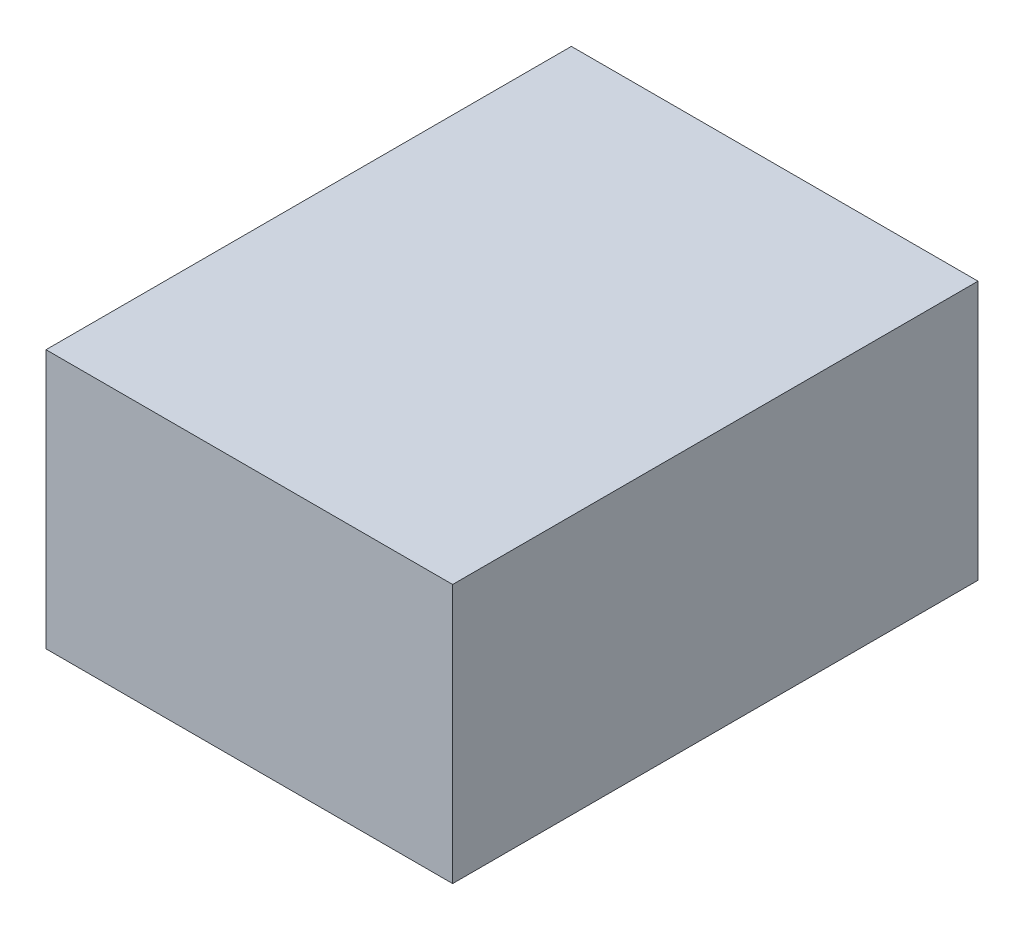
ISO-10303-21;
HEADER;
FILE_DESCRIPTION(('STEP AP214'),'2;1');
FILE_NAME('part.step','',(''),(''),'','','');
FILE_SCHEMA(('AUTOMOTIVE_DESIGN { 1 0 10303 214 1 1 1 1 }'));
ENDSEC;
DATA;
#1=APPLICATION_CONTEXT('core data for automotive mechanical design processes');
#2=APPLICATION_PROTOCOL_DEFINITION('international standard','automotive_design',2000,#1);
#3=PRODUCT_CONTEXT('',#1,'mechanical');
#4=PRODUCT('Part','Part','',(#3));
#5=PRODUCT_RELATED_PRODUCT_CATEGORY('part','',(#4));
#6=PRODUCT_DEFINITION_FORMATION('','',#4);
#7=PRODUCT_DEFINITION_CONTEXT('part definition',#1,'design');
#8=PRODUCT_DEFINITION('design','',#6,#7);
#9=PRODUCT_DEFINITION_SHAPE('','',#8);
#10=(LENGTH_UNIT() NAMED_UNIT(*) SI_UNIT(.MILLI.,.METRE.));
#11=(NAMED_UNIT(*) PLANE_ANGLE_UNIT() SI_UNIT($,.RADIAN.));
#12=(NAMED_UNIT(*) SI_UNIT($,.STERADIAN.) SOLID_ANGLE_UNIT());
#13=UNCERTAINTY_MEASURE_WITH_UNIT(LENGTH_MEASURE(1.E-05),#10,'distance_accuracy_value','');
#14=(GEOMETRIC_REPRESENTATION_CONTEXT(3) GLOBAL_UNCERTAINTY_ASSIGNED_CONTEXT((#13)) GLOBAL_UNIT_ASSIGNED_CONTEXT((#10,
#11,#12)) REPRESENTATION_CONTEXT('',''));
#15=CARTESIAN_POINT('',(0.,0.,0.));
#16=DIRECTION('',(0.,0.,1.));
#17=DIRECTION('',(1.,0.,0.));
#18=AXIS2_PLACEMENT_3D('',#15,#16,#17);
#19=CARTESIAN_POINT('',(0.,0.,0.));
#20=DIRECTION('',(0.,0.,1.));
#21=DIRECTION('',(1.,0.,0.));
#22=AXIS2_PLACEMENT_3D('',#19,#20,#21);
#23=PLANE('',#22);
#24=DIRECTION('',(-1.,0.,0.));
#25=VECTOR('',#24,1.);
#26=CARTESIAN_POINT('',(2500.,1675.,0.));
#27=LINE('',#26,#25);
#28=CARTESIAN_POINT('',(2500.,1675.,0.));
#29=VERTEX_POINT('',#28);
#30=CARTESIAN_POINT('',(-2500.,1675.,0.));
#31=VERTEX_POINT('',#30);
#32=EDGE_CURVE('E270',#29,#31,#27,.T.);
#33=ORIENTED_EDGE('',*,*,#32,.F.);
#34=DIRECTION('',(0.,-1.,0.));
#35=VECTOR('',#34,1.);
#36=CARTESIAN_POINT('',(2500.,1875.,0.));
#37=LINE('',#36,#35);
#38=CARTESIAN_POINT('',(2500.,1875.,0.));
#39=VERTEX_POINT('',#38);
#40=EDGE_CURVE('E265',#39,#29,#37,.T.);
#41=ORIENTED_EDGE('',*,*,#40,.F.);
#42=DIRECTION('',(1.,0.,0.));
#43=VECTOR('',#42,1.);
#44=CARTESIAN_POINT('',(2500.,1875.,0.));
#45=LINE('',#44,#43);
#46=CARTESIAN_POINT('',(-2500.,1875.,0.));
#47=VERTEX_POINT('',#46);
#48=EDGE_CURVE('E268',#47,#39,#45,.T.);
#49=ORIENTED_EDGE('',*,*,#48,.F.);
#50=DIRECTION('',(0.,1.,0.));
#51=VECTOR('',#50,1.);
#52=CARTESIAN_POINT('',(-2500.,1875.,0.));
#53=LINE('',#52,#51);
#54=EDGE_CURVE('E272',#31,#47,#53,.T.);
#55=ORIENTED_EDGE('',*,*,#54,.F.);
#56=EDGE_LOOP('',(#33,#41,#49,#55));
#57=FACE_BOUND('',#56,.T.);
#58=DIRECTION('',(0.,1.,0.));
#59=VECTOR('',#58,1.);
#60=CARTESIAN_POINT('',(3000.,-1875.,0.));
#61=LINE('',#60,#59);
#62=CARTESIAN_POINT('',(3000.,-1875.,0.));
#63=VERTEX_POINT('',#62);
#64=CARTESIAN_POINT('',(3000.,1875.,0.));
#65=VERTEX_POINT('',#64);
#66=EDGE_CURVE('E302',#63,#65,#61,.T.);
#67=ORIENTED_EDGE('',*,*,#66,.T.);
#68=DIRECTION('',(-1.,0.,0.));
#69=VECTOR('',#68,1.);
#70=CARTESIAN_POINT('',(3000.,1875.,0.));
#71=LINE('',#70,#69);
#72=CARTESIAN_POINT('',(2550.,1875.,0.));
#73=VERTEX_POINT('',#72);
#74=EDGE_CURVE('E337',#65,#73,#71,.T.);
#75=ORIENTED_EDGE('',*,*,#74,.T.);
#76=DIRECTION('',(0.,1.,0.));
#77=VECTOR('',#76,1.);
#78=CARTESIAN_POINT('',(2550.,-1875.,0.));
#79=LINE('',#78,#77);
#80=CARTESIAN_POINT('',(2550.,-1875.,0.));
#81=VERTEX_POINT('',#80);
#82=EDGE_CURVE('E333',#81,#73,#79,.T.);
#83=ORIENTED_EDGE('',*,*,#82,.F.);
#84=DIRECTION('',(-1.,0.,0.));
#85=VECTOR('',#84,1.);
#86=CARTESIAN_POINT('',(3000.,-1875.,0.));
#87=LINE('',#86,#85);
#88=EDGE_CURVE('E330',#63,#81,#87,.T.);
#89=ORIENTED_EDGE('',*,*,#88,.F.);
#90=EDGE_LOOP('',(#67,#75,#83,#89));
#91=FACE_BOUND('',#90,.T.);
#92=DIRECTION('',(0.,-1.,0.));
#93=VECTOR('',#92,1.);
#94=CARTESIAN_POINT('',(-3100.,-1975.,0.));
#95=LINE('',#94,#93);
#96=CARTESIAN_POINT('',(-3100.,1975.,0.));
#97=VERTEX_POINT('',#96);
#98=CARTESIAN_POINT('',(-3100.,-1975.,0.));
#99=VERTEX_POINT('',#98);
#100=EDGE_CURVE('E208',#97,#99,#95,.T.);
#101=ORIENTED_EDGE('',*,*,#100,.F.);
#102=DIRECTION('',(-1.,0.,0.));
#103=VECTOR('',#102,1.);
#104=CARTESIAN_POINT('',(3100.,1975.,0.));
#105=LINE('',#104,#103);
#106=CARTESIAN_POINT('',(3100.,1975.,0.));
#107=VERTEX_POINT('',#106);
#108=EDGE_CURVE('E386',#107,#97,#105,.T.);
#109=ORIENTED_EDGE('',*,*,#108,.F.);
#110=DIRECTION('',(0.,1.,0.));
#111=VECTOR('',#110,1.);
#112=CARTESIAN_POINT('',(3100.,-1975.,0.));
#113=LINE('',#112,#111);
#114=CARTESIAN_POINT('',(3100.,-1975.,0.));
#115=VERTEX_POINT('',#114);
#116=EDGE_CURVE('E384',#115,#107,#113,.T.);
#117=ORIENTED_EDGE('',*,*,#116,.F.);
#118=DIRECTION('',(1.,0.,0.));
#119=VECTOR('',#118,1.);
#120=CARTESIAN_POINT('',(3100.,-1975.,0.));
#121=LINE('',#120,#119);
#122=EDGE_CURVE('E382',#99,#115,#121,.T.);
#123=ORIENTED_EDGE('',*,*,#122,.F.);
#124=EDGE_LOOP('',(#101,#109,#117,#123));
#125=FACE_BOUND('',#124,.T.);
#126=DIRECTION('',(0.,-1.,0.));
#127=VECTOR('',#126,1.);
#128=CARTESIAN_POINT('',(-2500.,-1875.,0.));
#129=LINE('',#128,#127);
#130=CARTESIAN_POINT('',(-2500.,1625.,0.));
#131=VERTEX_POINT('',#130);
#132=CARTESIAN_POINT('',(-2500.,-1875.,0.));
#133=VERTEX_POINT('',#132);
#134=EDGE_CURVE('E319',#131,#133,#129,.T.);
#135=ORIENTED_EDGE('',*,*,#134,.T.);
#136=DIRECTION('',(1.,0.,0.));
#137=VECTOR('',#136,1.);
#138=CARTESIAN_POINT('',(-2500.,-1875.,0.));
#139=LINE('',#138,#137);
#140=CARTESIAN_POINT('',(2500.,-1875.,0.));
#141=VERTEX_POINT('',#140);
#142=EDGE_CURVE('E364',#133,#141,#139,.T.);
#143=ORIENTED_EDGE('',*,*,#142,.T.);
#144=DIRECTION('',(0.,1.,0.));
#145=VECTOR('',#144,1.);
#146=CARTESIAN_POINT('',(2500.,-1875.,0.));
#147=LINE('',#146,#145);
#148=CARTESIAN_POINT('',(2500.,1625.,0.));
#149=VERTEX_POINT('',#148);
#150=EDGE_CURVE('E367',#141,#149,#147,.T.);
#151=ORIENTED_EDGE('',*,*,#150,.T.);
#152=DIRECTION('',(-1.,0.,0.));
#153=VECTOR('',#152,1.);
#154=CARTESIAN_POINT('',(-2500.,1625.,0.));
#155=LINE('',#154,#153);
#156=EDGE_CURVE('E355',#149,#131,#155,.T.);
#157=ORIENTED_EDGE('',*,*,#156,.T.);
#158=EDGE_LOOP('',(#135,#143,#151,#157));
#159=FACE_BOUND('',#158,.T.);
#160=DIRECTION('',(0.,1.,0.));
#161=VECTOR('',#160,1.);
#162=CARTESIAN_POINT('',(-2550.,-1882.08551102095,0.));
#163=LINE('',#162,#161);
#164=CARTESIAN_POINT('',(-2550.,-1882.08551102095,0.));
#165=VERTEX_POINT('',#164);
#166=CARTESIAN_POINT('',(-2550.,1867.91448897905,0.));
#167=VERTEX_POINT('',#166);
#168=EDGE_CURVE('E298',#165,#167,#163,.T.);
#169=ORIENTED_EDGE('',*,*,#168,.T.);
#170=DIRECTION('',(-1.,0.,0.));
#171=VECTOR('',#170,1.);
#172=CARTESIAN_POINT('',(-2550.,1867.91448897905,0.));
#173=LINE('',#172,#171);
#174=CARTESIAN_POINT('',(-3000.,1867.91448897905,0.));
#175=VERTEX_POINT('',#174);
#176=EDGE_CURVE('E301',#167,#175,#173,.T.);
#177=ORIENTED_EDGE('',*,*,#176,.T.);
#178=DIRECTION('',(0.,1.,0.));
#179=VECTOR('',#178,1.);
#180=CARTESIAN_POINT('',(-3000.,-1882.08551102095,0.));
#181=LINE('',#180,#179);
#182=CARTESIAN_POINT('',(-3000.,-1882.08551102095,0.));
#183=VERTEX_POINT('',#182);
#184=EDGE_CURVE('E305',#183,#175,#181,.T.);
#185=ORIENTED_EDGE('',*,*,#184,.F.);
#186=DIRECTION('',(-1.,0.,0.));
#187=VECTOR('',#186,1.);
#188=CARTESIAN_POINT('',(-2550.,-1882.08551102095,0.));
#189=LINE('',#188,#187);
#190=EDGE_CURVE('E289',#165,#183,#189,.T.);
#191=ORIENTED_EDGE('',*,*,#190,.F.);
#192=EDGE_LOOP('',(#169,#177,#185,#191));
#193=FACE_BOUND('',#192,.T.);
#194=ADVANCED_FACE('F41',(#57,#91,#125,#159,#193),#23,.F.);
#195=CARTESIAN_POINT('',(-3100.,-1975.,8000.));
#196=DIRECTION('',(1.,0.,0.));
#197=DIRECTION('',(0.,0.,-1.));
#198=AXIS2_PLACEMENT_3D('',#195,#196,#197);
#199=PLANE('',#198);
#200=ORIENTED_EDGE('',*,*,#100,.T.);
#201=DIRECTION('',(0.,0.,-1.));
#202=VECTOR('',#201,1.);
#203=CARTESIAN_POINT('',(-3100.,-1975.,8000.));
#204=LINE('',#203,#202);
#205=CARTESIAN_POINT('',(-3100.,-1975.,8010.));
#206=VERTEX_POINT('',#205);
#207=EDGE_CURVE('E49',#206,#99,#204,.T.);
#208=ORIENTED_EDGE('',*,*,#207,.F.);
#209=DIRECTION('',(0.,-1.,0.));
#210=VECTOR('',#209,1.);
#211=CARTESIAN_POINT('',(-3100.,-1975.,8010.));
#212=LINE('',#211,#210);
#213=CARTESIAN_POINT('',(-3100.,1975.,8010.));
#214=VERTEX_POINT('',#213);
#215=EDGE_CURVE('E206',#214,#206,#212,.T.);
#216=ORIENTED_EDGE('',*,*,#215,.F.);
#217=DIRECTION('',(0.,0.,-1.));
#218=VECTOR('',#217,1.);
#219=CARTESIAN_POINT('',(-3100.,1975.,8000.));
#220=LINE('',#219,#218);
#221=EDGE_CURVE('E388',#214,#97,#220,.T.);
#222=ORIENTED_EDGE('',*,*,#221,.T.);
#223=EDGE_LOOP('',(#200,#208,#216,#222));
#224=FACE_BOUND('',#223,.T.);
#225=ADVANCED_FACE('F43',(#224),#199,.F.);
#226=CARTESIAN_POINT('',(3100.,-1975.,8000.));
#227=DIRECTION('',(0.,1.,0.));
#228=DIRECTION('',(-1.,0.,0.));
#229=AXIS2_PLACEMENT_3D('',#226,#227,#228);
#230=PLANE('',#229);
#231=ORIENTED_EDGE('',*,*,#122,.T.);
#232=DIRECTION('',(0.,0.,-1.));
#233=VECTOR('',#232,1.);
#234=CARTESIAN_POINT('',(3100.,-1975.,8000.));
#235=LINE('',#234,#233);
#236=CARTESIAN_POINT('',(3100.,-1975.,8010.));
#237=VERTEX_POINT('',#236);
#238=EDGE_CURVE('E210',#237,#115,#235,.T.);
#239=ORIENTED_EDGE('',*,*,#238,.F.);
#240=DIRECTION('',(1.,0.,0.));
#241=VECTOR('',#240,1.);
#242=CARTESIAN_POINT('',(-3100.,-1975.,8010.));
#243=LINE('',#242,#241);
#244=EDGE_CURVE('E212',#206,#237,#243,.T.);
#245=ORIENTED_EDGE('',*,*,#244,.F.);
#246=ORIENTED_EDGE('',*,*,#207,.T.);
#247=EDGE_LOOP('',(#231,#239,#245,#246));
#248=FACE_BOUND('',#247,.T.);
#249=ADVANCED_FACE('F213',(#248),#230,.F.);
#250=CARTESIAN_POINT('',(3100.,-1975.,8000.));
#251=DIRECTION('',(-1.,0.,0.));
#252=DIRECTION('',(0.,0.,1.));
#253=AXIS2_PLACEMENT_3D('',#250,#251,#252);
#254=PLANE('',#253);
#255=ORIENTED_EDGE('',*,*,#116,.T.);
#256=DIRECTION('',(0.,0.,-1.));
#257=VECTOR('',#256,1.);
#258=CARTESIAN_POINT('',(3100.,1975.,8000.));
#259=LINE('',#258,#257);
#260=CARTESIAN_POINT('',(3100.,1975.,8010.));
#261=VERTEX_POINT('',#260);
#262=EDGE_CURVE('E390',#261,#107,#259,.T.);
#263=ORIENTED_EDGE('',*,*,#262,.F.);
#264=DIRECTION('',(0.,1.,0.));
#265=VECTOR('',#264,1.);
#266=CARTESIAN_POINT('',(3100.,-1975.,8010.));
#267=LINE('',#266,#265);
#268=EDGE_CURVE('E218',#237,#261,#267,.T.);
#269=ORIENTED_EDGE('',*,*,#268,.F.);
#270=ORIENTED_EDGE('',*,*,#238,.T.);
#271=EDGE_LOOP('',(#255,#263,#269,#270));
#272=FACE_BOUND('',#271,.T.);
#273=ADVANCED_FACE('F395',(#272),#254,.F.);
#274=CARTESIAN_POINT('',(3100.,1975.,8000.));
#275=DIRECTION('',(0.,-1.,0.));
#276=DIRECTION('',(1.,0.,0.));
#277=AXIS2_PLACEMENT_3D('',#274,#275,#276);
#278=PLANE('',#277);
#279=ORIENTED_EDGE('',*,*,#108,.T.);
#280=ORIENTED_EDGE('',*,*,#221,.F.);
#281=DIRECTION('',(-1.,0.,0.));
#282=VECTOR('',#281,1.);
#283=CARTESIAN_POINT('',(-3100.,1975.,8010.));
#284=LINE('',#283,#282);
#285=EDGE_CURVE('E223',#261,#214,#284,.T.);
#286=ORIENTED_EDGE('',*,*,#285,.F.);
#287=ORIENTED_EDGE('',*,*,#262,.T.);
#288=EDGE_LOOP('',(#279,#280,#286,#287));
#289=FACE_BOUND('',#288,.T.);
#290=ADVANCED_FACE('F400',(#289),#278,.F.);
#291=CARTESIAN_POINT('',(-2500.,-1875.,6200.));
#292=DIRECTION('',(1.,0.,0.));
#293=DIRECTION('',(0.,0.,-1.));
#294=AXIS2_PLACEMENT_3D('',#291,#292,#293);
#295=PLANE('',#294);
#296=ORIENTED_EDGE('',*,*,#134,.F.);
#297=DIRECTION('',(0.,0.,-1.));
#298=VECTOR('',#297,1.);
#299=CARTESIAN_POINT('',(-2500.,1625.,6200.));
#300=LINE('',#299,#298);
#301=CARTESIAN_POINT('',(-2500.,1625.,6200.));
#302=VERTEX_POINT('',#301);
#303=EDGE_CURVE('E361',#302,#131,#300,.T.);
#304=ORIENTED_EDGE('',*,*,#303,.F.);
#305=DIRECTION('',(0.,-1.,0.));
#306=VECTOR('',#305,1.);
#307=CARTESIAN_POINT('',(-2500.,-1875.,6200.));
#308=LINE('',#307,#306);
#309=CARTESIAN_POINT('',(-2500.,-1875.,6200.));
#310=VERTEX_POINT('',#309);
#311=EDGE_CURVE('E351',#302,#310,#308,.T.);
#312=ORIENTED_EDGE('',*,*,#311,.T.);
#313=DIRECTION('',(0.,0.,-1.));
#314=VECTOR('',#313,1.);
#315=CARTESIAN_POINT('',(-2500.,-1875.,6200.));
#316=LINE('',#315,#314);
#317=EDGE_CURVE('E378',#310,#133,#316,.T.);
#318=ORIENTED_EDGE('',*,*,#317,.T.);
#319=EDGE_LOOP('',(#296,#304,#312,#318));
#320=FACE_BOUND('',#319,.T.);
#321=ADVANCED_FACE('F402',(#320),#295,.T.);
#322=CARTESIAN_POINT('',(-2500.,-1875.,6200.));
#323=DIRECTION('',(0.,1.,0.));
#324=DIRECTION('',(0.,0.,1.));
#325=AXIS2_PLACEMENT_3D('',#322,#323,#324);
#326=PLANE('',#325);
#327=ORIENTED_EDGE('',*,*,#142,.F.);
#328=ORIENTED_EDGE('',*,*,#317,.F.);
#329=DIRECTION('',(1.,0.,0.));
#330=VECTOR('',#329,1.);
#331=CARTESIAN_POINT('',(-2500.,-1875.,6200.));
#332=LINE('',#331,#330);
#333=CARTESIAN_POINT('',(2500.,-1875.,6200.));
#334=VERTEX_POINT('',#333);
#335=EDGE_CURVE('E354',#310,#334,#332,.T.);
#336=ORIENTED_EDGE('',*,*,#335,.T.);
#337=DIRECTION('',(0.,0.,-1.));
#338=VECTOR('',#337,1.);
#339=CARTESIAN_POINT('',(2500.,-1875.,6200.));
#340=LINE('',#339,#338);
#341=EDGE_CURVE('E376',#334,#141,#340,.T.);
#342=ORIENTED_EDGE('',*,*,#341,.T.);
#343=EDGE_LOOP('',(#327,#328,#336,#342));
#344=FACE_BOUND('',#343,.T.);
#345=ADVANCED_FACE('F409',(#344),#326,.T.);
#346=CARTESIAN_POINT('',(2500.,-1875.,6200.));
#347=DIRECTION('',(-1.,0.,0.));
#348=DIRECTION('',(0.,0.,1.));
#349=AXIS2_PLACEMENT_3D('',#346,#347,#348);
#350=PLANE('',#349);
#351=ORIENTED_EDGE('',*,*,#150,.F.);
#352=ORIENTED_EDGE('',*,*,#341,.F.);
#353=DIRECTION('',(0.,1.,0.));
#354=VECTOR('',#353,1.);
#355=CARTESIAN_POINT('',(2500.,-1875.,6200.));
#356=LINE('',#355,#354);
#357=CARTESIAN_POINT('',(2500.,1625.,6200.));
#358=VERTEX_POINT('',#357);
#359=EDGE_CURVE('E357',#334,#358,#356,.T.);
#360=ORIENTED_EDGE('',*,*,#359,.T.);
#361=DIRECTION('',(0.,0.,-1.));
#362=VECTOR('',#361,1.);
#363=CARTESIAN_POINT('',(2500.,1625.,6200.));
#364=LINE('',#363,#362);
#365=EDGE_CURVE('E374',#358,#149,#364,.T.);
#366=ORIENTED_EDGE('',*,*,#365,.T.);
#367=EDGE_LOOP('',(#351,#352,#360,#366));
#368=FACE_BOUND('',#367,.T.);
#369=ADVANCED_FACE('F424',(#368),#350,.T.);
#370=CARTESIAN_POINT('',(-2500.,1625.,6200.));
#371=DIRECTION('',(0.,-1.,0.));
#372=DIRECTION('',(0.,0.,-1.));
#373=AXIS2_PLACEMENT_3D('',#370,#371,#372);
#374=PLANE('',#373);
#375=ORIENTED_EDGE('',*,*,#156,.F.);
#376=ORIENTED_EDGE('',*,*,#365,.F.);
#377=DIRECTION('',(-1.,0.,0.));
#378=VECTOR('',#377,1.);
#379=CARTESIAN_POINT('',(-2500.,1625.,6200.));
#380=LINE('',#379,#378);
#381=EDGE_CURVE('E359',#358,#302,#380,.T.);
#382=ORIENTED_EDGE('',*,*,#381,.T.);
#383=ORIENTED_EDGE('',*,*,#303,.T.);
#384=EDGE_LOOP('',(#375,#376,#382,#383));
#385=FACE_BOUND('',#384,.T.);
#386=ADVANCED_FACE('F428',(#385),#374,.T.);
#387=CARTESIAN_POINT('',(0.,0.,6200.));
#388=DIRECTION('',(0.,0.,-1.));
#389=DIRECTION('',(-1.,0.,0.));
#390=AXIS2_PLACEMENT_3D('',#387,#388,#389);
#391=PLANE('',#390);
#392=ORIENTED_EDGE('',*,*,#311,.F.);
#393=ORIENTED_EDGE('',*,*,#381,.F.);
#394=ORIENTED_EDGE('',*,*,#359,.F.);
#395=ORIENTED_EDGE('',*,*,#335,.F.);
#396=EDGE_LOOP('',(#392,#393,#394,#395));
#397=FACE_BOUND('',#396,.T.);
#398=ADVANCED_FACE('F432',(#397),#391,.T.);
#399=CARTESIAN_POINT('',(3000.,-1875.,6200.));
#400=DIRECTION('',(-1.,0.,0.));
#401=DIRECTION('',(0.,0.,1.));
#402=AXIS2_PLACEMENT_3D('',#399,#400,#401);
#403=PLANE('',#402);
#404=ORIENTED_EDGE('',*,*,#66,.F.);
#405=DIRECTION('',(0.,0.,-1.));
#406=VECTOR('',#405,1.);
#407=CARTESIAN_POINT('',(3000.,-1875.,6200.));
#408=LINE('',#407,#406);
#409=CARTESIAN_POINT('',(3000.,-1875.,6200.));
#410=VERTEX_POINT('',#409);
#411=EDGE_CURVE('E326',#410,#63,#408,.T.);
#412=ORIENTED_EDGE('',*,*,#411,.F.);
#413=DIRECTION('',(0.,1.,0.));
#414=VECTOR('',#413,1.);
#415=CARTESIAN_POINT('',(3000.,-1875.,6200.));
#416=LINE('',#415,#414);
#417=CARTESIAN_POINT('',(3000.,1875.,6200.));
#418=VERTEX_POINT('',#417);
#419=EDGE_CURVE('E334',#410,#418,#416,.T.);
#420=ORIENTED_EDGE('',*,*,#419,.T.);
#421=DIRECTION('',(0.,0.,-1.));
#422=VECTOR('',#421,1.);
#423=CARTESIAN_POINT('',(3000.,1875.,6200.));
#424=LINE('',#423,#422);
#425=EDGE_CURVE('E279',#418,#65,#424,.T.);
#426=ORIENTED_EDGE('',*,*,#425,.T.);
#427=EDGE_LOOP('',(#404,#412,#420,#426));
#428=FACE_BOUND('',#427,.T.);
#429=ADVANCED_FACE('F436',(#428),#403,.T.);
#430=CARTESIAN_POINT('',(3000.,1875.,6200.));
#431=DIRECTION('',(0.,-1.,0.));
#432=DIRECTION('',(0.,0.,-1.));
#433=AXIS2_PLACEMENT_3D('',#430,#431,#432);
#434=PLANE('',#433);
#435=ORIENTED_EDGE('',*,*,#74,.F.);
#436=ORIENTED_EDGE('',*,*,#425,.F.);
#437=DIRECTION('',(-1.,0.,0.));
#438=VECTOR('',#437,1.);
#439=CARTESIAN_POINT('',(3000.,1875.,6200.));
#440=LINE('',#439,#438);
#441=CARTESIAN_POINT('',(2550.,1875.,6200.));
#442=VERTEX_POINT('',#441);
#443=EDGE_CURVE('E347',#418,#442,#440,.T.);
#444=ORIENTED_EDGE('',*,*,#443,.T.);
#445=DIRECTION('',(0.,0.,-1.));
#446=VECTOR('',#445,1.);
#447=CARTESIAN_POINT('',(2550.,1875.,6200.));
#448=LINE('',#447,#446);
#449=EDGE_CURVE('E322',#442,#73,#448,.T.);
#450=ORIENTED_EDGE('',*,*,#449,.T.);
#451=EDGE_LOOP('',(#435,#436,#444,#450));
#452=FACE_BOUND('',#451,.T.);
#453=ADVANCED_FACE('F450',(#452),#434,.T.);
#454=CARTESIAN_POINT('',(2550.,-1875.,6200.));
#455=DIRECTION('',(-1.,0.,0.));
#456=DIRECTION('',(0.,0.,1.));
#457=AXIS2_PLACEMENT_3D('',#454,#455,#456);
#458=PLANE('',#457);
#459=ORIENTED_EDGE('',*,*,#82,.T.);
#460=ORIENTED_EDGE('',*,*,#449,.F.);
#461=DIRECTION('',(0.,1.,0.));
#462=VECTOR('',#461,1.);
#463=CARTESIAN_POINT('',(2550.,-1875.,6200.));
#464=LINE('',#463,#462);
#465=CARTESIAN_POINT('',(2550.,-1875.,6200.));
#466=VERTEX_POINT('',#465);
#467=EDGE_CURVE('E344',#466,#442,#464,.T.);
#468=ORIENTED_EDGE('',*,*,#467,.F.);
#469=DIRECTION('',(0.,0.,-1.));
#470=VECTOR('',#469,1.);
#471=CARTESIAN_POINT('',(2550.,-1875.,6200.));
#472=LINE('',#471,#470);
#473=EDGE_CURVE('E324',#466,#81,#472,.T.);
#474=ORIENTED_EDGE('',*,*,#473,.T.);
#475=EDGE_LOOP('',(#459,#460,#468,#474));
#476=FACE_BOUND('',#475,.T.);
#477=ADVANCED_FACE('F446',(#476),#458,.F.);
#478=CARTESIAN_POINT('',(3000.,-1875.,6200.));
#479=DIRECTION('',(0.,-1.,0.));
#480=DIRECTION('',(1.,0.,0.));
#481=AXIS2_PLACEMENT_3D('',#478,#479,#480);
#482=PLANE('',#481);
#483=ORIENTED_EDGE('',*,*,#88,.T.);
#484=ORIENTED_EDGE('',*,*,#473,.F.);
#485=DIRECTION('',(-1.,0.,0.));
#486=VECTOR('',#485,1.);
#487=CARTESIAN_POINT('',(3000.,-1875.,6200.));
#488=LINE('',#487,#486);
#489=EDGE_CURVE('E329',#410,#466,#488,.T.);
#490=ORIENTED_EDGE('',*,*,#489,.F.);
#491=ORIENTED_EDGE('',*,*,#411,.T.);
#492=EDGE_LOOP('',(#483,#484,#490,#491));
#493=FACE_BOUND('',#492,.T.);
#494=ADVANCED_FACE('F442',(#493),#482,.F.);
#495=CARTESIAN_POINT('',(0.,0.,6200.));
#496=DIRECTION('',(0.,0.,1.));
#497=DIRECTION('',(1.,0.,0.));
#498=AXIS2_PLACEMENT_3D('',#495,#496,#497);
#499=PLANE('',#498);
#500=ORIENTED_EDGE('',*,*,#419,.F.);
#501=ORIENTED_EDGE('',*,*,#489,.T.);
#502=ORIENTED_EDGE('',*,*,#467,.T.);
#503=ORIENTED_EDGE('',*,*,#443,.F.);
#504=EDGE_LOOP('',(#500,#501,#502,#503));
#505=FACE_BOUND('',#504,.T.);
#506=ADVANCED_FACE('F438',(#505),#499,.F.);
#507=CARTESIAN_POINT('',(-2550.,-1882.08551102095,6200.));
#508=DIRECTION('',(-1.,0.,0.));
#509=DIRECTION('',(0.,0.,1.));
#510=AXIS2_PLACEMENT_3D('',#507,#508,#509);
#511=PLANE('',#510);
#512=ORIENTED_EDGE('',*,*,#168,.F.);
#513=DIRECTION('',(0.,0.,-1.));
#514=VECTOR('',#513,1.);
#515=CARTESIAN_POINT('',(-2550.,-1882.08551102095,6200.));
#516=LINE('',#515,#514);
#517=CARTESIAN_POINT('',(-2550.,-1882.08551102095,6200.));
#518=VERTEX_POINT('',#517);
#519=EDGE_CURVE('E297',#518,#165,#516,.T.);
#520=ORIENTED_EDGE('',*,*,#519,.F.);
#521=DIRECTION('',(0.,1.,0.));
#522=VECTOR('',#521,1.);
#523=CARTESIAN_POINT('',(-2550.,-1882.08551102095,6200.));
#524=LINE('',#523,#522);
#525=CARTESIAN_POINT('',(-2550.,1867.91448897905,6200.));
#526=VERTEX_POINT('',#525);
#527=EDGE_CURVE('E285',#518,#526,#524,.T.);
#528=ORIENTED_EDGE('',*,*,#527,.T.);
#529=DIRECTION('',(0.,0.,-1.));
#530=VECTOR('',#529,1.);
#531=CARTESIAN_POINT('',(-2550.,1867.91448897905,6200.));
#532=LINE('',#531,#530);
#533=EDGE_CURVE('E316',#526,#167,#532,.T.);
#534=ORIENTED_EDGE('',*,*,#533,.T.);
#535=EDGE_LOOP('',(#512,#520,#528,#534));
#536=FACE_BOUND('',#535,.T.);
#537=ADVANCED_FACE('F441',(#536),#511,.T.);
#538=CARTESIAN_POINT('',(-2550.,1867.91448897905,6200.));
#539=DIRECTION('',(0.,-1.,0.));
#540=DIRECTION('',(0.,0.,-1.));
#541=AXIS2_PLACEMENT_3D('',#538,#539,#540);
#542=PLANE('',#541);
#543=ORIENTED_EDGE('',*,*,#176,.F.);
#544=ORIENTED_EDGE('',*,*,#533,.F.);
#545=DIRECTION('',(-1.,0.,0.));
#546=VECTOR('',#545,1.);
#547=CARTESIAN_POINT('',(-2550.,1867.91448897905,6200.));
#548=LINE('',#547,#546);
#549=CARTESIAN_POINT('',(-3000.,1867.91448897905,6200.));
#550=VERTEX_POINT('',#549);
#551=EDGE_CURVE('E288',#526,#550,#548,.T.);
#552=ORIENTED_EDGE('',*,*,#551,.T.);
#553=DIRECTION('',(0.,0.,-1.));
#554=VECTOR('',#553,1.);
#555=CARTESIAN_POINT('',(-3000.,1867.91448897905,6200.));
#556=LINE('',#555,#554);
#557=EDGE_CURVE('E314',#550,#175,#556,.T.);
#558=ORIENTED_EDGE('',*,*,#557,.T.);
#559=EDGE_LOOP('',(#543,#544,#552,#558));
#560=FACE_BOUND('',#559,.T.);
#561=ADVANCED_FACE('F460',(#560),#542,.T.);
#562=CARTESIAN_POINT('',(-3000.,-1882.08551102095,6200.));
#563=DIRECTION('',(-1.,0.,0.));
#564=DIRECTION('',(0.,0.,1.));
#565=AXIS2_PLACEMENT_3D('',#562,#563,#564);
#566=PLANE('',#565);
#567=ORIENTED_EDGE('',*,*,#184,.T.);
#568=ORIENTED_EDGE('',*,*,#557,.F.);
#569=DIRECTION('',(0.,1.,0.));
#570=VECTOR('',#569,1.);
#571=CARTESIAN_POINT('',(-3000.,-1882.08551102095,6200.));
#572=LINE('',#571,#570);
#573=CARTESIAN_POINT('',(-3000.,-1882.08551102095,6200.));
#574=VERTEX_POINT('',#573);
#575=EDGE_CURVE('E291',#574,#550,#572,.T.);
#576=ORIENTED_EDGE('',*,*,#575,.F.);
#577=DIRECTION('',(0.,0.,-1.));
#578=VECTOR('',#577,1.);
#579=CARTESIAN_POINT('',(-3000.,-1882.08551102095,6200.));
#580=LINE('',#579,#578);
#581=EDGE_CURVE('E312',#574,#183,#580,.T.);
#582=ORIENTED_EDGE('',*,*,#581,.T.);
#583=EDGE_LOOP('',(#567,#568,#576,#582));
#584=FACE_BOUND('',#583,.T.);
#585=ADVANCED_FACE('F464',(#584),#566,.F.);
#586=CARTESIAN_POINT('',(-2550.,-1882.08551102095,6200.));
#587=DIRECTION('',(0.,-1.,0.));
#588=DIRECTION('',(0.,0.,-1.));
#589=AXIS2_PLACEMENT_3D('',#586,#587,#588);
#590=PLANE('',#589);
#591=ORIENTED_EDGE('',*,*,#190,.T.);
#592=ORIENTED_EDGE('',*,*,#581,.F.);
#593=DIRECTION('',(-1.,0.,0.));
#594=VECTOR('',#593,1.);
#595=CARTESIAN_POINT('',(-2550.,-1882.08551102095,6200.));
#596=LINE('',#595,#594);
#597=EDGE_CURVE('E294',#518,#574,#596,.T.);
#598=ORIENTED_EDGE('',*,*,#597,.F.);
#599=ORIENTED_EDGE('',*,*,#519,.T.);
#600=EDGE_LOOP('',(#591,#592,#598,#599));
#601=FACE_BOUND('',#600,.T.);
#602=ADVANCED_FACE('F468',(#601),#590,.F.);
#603=CARTESIAN_POINT('',(0.,0.,6200.));
#604=DIRECTION('',(0.,0.,1.));
#605=DIRECTION('',(1.,0.,0.));
#606=AXIS2_PLACEMENT_3D('',#603,#604,#605);
#607=PLANE('',#606);
#608=ORIENTED_EDGE('',*,*,#527,.F.);
#609=ORIENTED_EDGE('',*,*,#597,.T.);
#610=ORIENTED_EDGE('',*,*,#575,.T.);
#611=ORIENTED_EDGE('',*,*,#551,.F.);
#612=EDGE_LOOP('',(#608,#609,#610,#611));
#613=FACE_BOUND('',#612,.T.);
#614=ADVANCED_FACE('F472',(#613),#607,.F.);
#615=CARTESIAN_POINT('',(2500.,1875.,8000.));
#616=DIRECTION('',(1.,0.,0.));
#617=DIRECTION('',(0.,1.,0.));
#618=AXIS2_PLACEMENT_3D('',#615,#616,#617);
#619=PLANE('',#618);
#620=DIRECTION('',(0.,0.,-1.));
#621=VECTOR('',#620,1.);
#622=CARTESIAN_POINT('',(2500.,1675.,8000.));
#623=LINE('',#622,#621);
#624=CARTESIAN_POINT('',(2500.,1675.,6400.));
#625=VERTEX_POINT('',#624);
#626=EDGE_CURVE('E62',#625,#29,#623,.T.);
#627=ORIENTED_EDGE('',*,*,#626,.F.);
#628=DIRECTION('',(0.,1.,0.));
#629=VECTOR('',#628,1.);
#630=CARTESIAN_POINT('',(2500.,1875.,6400.));
#631=LINE('',#630,#629);
#632=CARTESIAN_POINT('',(2500.,1875.,6400.));
#633=VERTEX_POINT('',#632);
#634=EDGE_CURVE('E56',#625,#633,#631,.T.);
#635=ORIENTED_EDGE('',*,*,#634,.T.);
#636=DIRECTION('',(0.,0.,-1.));
#637=VECTOR('',#636,1.);
#638=CARTESIAN_POINT('',(2500.,1875.,8000.));
#639=LINE('',#638,#637);
#640=EDGE_CURVE('E277',#633,#39,#639,.T.);
#641=ORIENTED_EDGE('',*,*,#640,.T.);
#642=ORIENTED_EDGE('',*,*,#40,.T.);
#643=EDGE_LOOP('',(#627,#635,#641,#642));
#644=FACE_BOUND('',#643,.T.);
#645=ADVANCED_FACE('F476',(#644),#619,.F.);
#646=CARTESIAN_POINT('',(2500.,1875.,8000.));
#647=DIRECTION('',(0.,1.,0.));
#648=DIRECTION('',(0.,0.,1.));
#649=AXIS2_PLACEMENT_3D('',#646,#647,#648);
#650=PLANE('',#649);
#651=ORIENTED_EDGE('',*,*,#640,.F.);
#652=DIRECTION('',(-1.,0.,0.));
#653=VECTOR('',#652,1.);
#654=CARTESIAN_POINT('',(-3000.,1875.,6400.));
#655=LINE('',#654,#653);
#656=CARTESIAN_POINT('',(3000.,1875.,6400.));
#657=VERTEX_POINT('',#656);
#658=EDGE_CURVE('E240',#657,#633,#655,.T.);
#659=ORIENTED_EDGE('',*,*,#658,.F.);
#660=DIRECTION('',(0.,0.,1.));
#661=VECTOR('',#660,1.);
#662=CARTESIAN_POINT('',(3000.,1875.,6400.));
#663=LINE('',#662,#661);
#664=CARTESIAN_POINT('',(3000.,1875.,8000.));
#665=VERTEX_POINT('',#664);
#666=EDGE_CURVE('E254',#657,#665,#663,.T.);
#667=ORIENTED_EDGE('',*,*,#666,.T.);
#668=DIRECTION('',(1.,0.,0.));
#669=VECTOR('',#668,1.);
#670=CARTESIAN_POINT('',(2500.,1875.,8000.));
#671=LINE('',#670,#669);
#672=CARTESIAN_POINT('',(-3000.,1875.,8000.));
#673=VERTEX_POINT('',#672);
#674=EDGE_CURVE('E266',#673,#665,#671,.T.);
#675=ORIENTED_EDGE('',*,*,#674,.F.);
#676=DIRECTION('',(0.,0.,1.));
#677=VECTOR('',#676,1.);
#678=CARTESIAN_POINT('',(-3000.,1875.,6400.));
#679=LINE('',#678,#677);
#680=CARTESIAN_POINT('',(-3000.,1875.,6400.));
#681=VERTEX_POINT('',#680);
#682=EDGE_CURVE('E250',#681,#673,#679,.T.);
#683=ORIENTED_EDGE('',*,*,#682,.F.);
#684=CARTESIAN_POINT('',(-2500.,1875.,6400.));
#685=VERTEX_POINT('',#684);
#686=EDGE_CURVE('E239',#685,#681,#655,.T.);
#687=ORIENTED_EDGE('',*,*,#686,.F.);
#688=DIRECTION('',(0.,0.,-1.));
#689=VECTOR('',#688,1.);
#690=CARTESIAN_POINT('',(-2500.,1875.,8000.));
#691=LINE('',#690,#689);
#692=EDGE_CURVE('E280',#685,#47,#691,.T.);
#693=ORIENTED_EDGE('',*,*,#692,.T.);
#694=ORIENTED_EDGE('',*,*,#48,.T.);
#695=EDGE_LOOP('',(#651,#659,#667,#675,#683,#687,#693,#694));
#696=FACE_BOUND('',#695,.T.);
#697=ADVANCED_FACE('F480',(#696),#650,.F.);
#698=CARTESIAN_POINT('',(-2500.,1875.,8000.));
#699=DIRECTION('',(-1.,0.,0.));
#700=DIRECTION('',(0.,-1.,0.));
#701=AXIS2_PLACEMENT_3D('',#698,#699,#700);
#702=PLANE('',#701);
#703=ORIENTED_EDGE('',*,*,#692,.F.);
#704=DIRECTION('',(0.,-1.,0.));
#705=VECTOR('',#704,1.);
#706=CARTESIAN_POINT('',(-2500.,1875.,6400.));
#707=LINE('',#706,#705);
#708=CARTESIAN_POINT('',(-2500.,1675.,6400.));
#709=VERTEX_POINT('',#708);
#710=EDGE_CURVE('E253',#685,#709,#707,.T.);
#711=ORIENTED_EDGE('',*,*,#710,.T.);
#712=DIRECTION('',(0.,0.,-1.));
#713=VECTOR('',#712,1.);
#714=CARTESIAN_POINT('',(-2500.,1675.,8000.));
#715=LINE('',#714,#713);
#716=EDGE_CURVE('E282',#709,#31,#715,.T.);
#717=ORIENTED_EDGE('',*,*,#716,.T.);
#718=ORIENTED_EDGE('',*,*,#54,.T.);
#719=EDGE_LOOP('',(#703,#711,#717,#718));
#720=FACE_BOUND('',#719,.T.);
#721=ADVANCED_FACE('F486',(#720),#702,.F.);
#722=CARTESIAN_POINT('',(2500.,1675.,8000.));
#723=DIRECTION('',(0.,-1.,0.));
#724=DIRECTION('',(0.,0.,-1.));
#725=AXIS2_PLACEMENT_3D('',#722,#723,#724);
#726=PLANE('',#725);
#727=ORIENTED_EDGE('',*,*,#716,.F.);
#728=DIRECTION('',(1.,0.,0.));
#729=VECTOR('',#728,1.);
#730=CARTESIAN_POINT('',(2500.,1675.,6400.));
#731=LINE('',#730,#729);
#732=EDGE_CURVE('E11',#709,#625,#731,.T.);
#733=ORIENTED_EDGE('',*,*,#732,.T.);
#734=ORIENTED_EDGE('',*,*,#626,.T.);
#735=ORIENTED_EDGE('',*,*,#32,.T.);
#736=EDGE_LOOP('',(#727,#733,#734,#735));
#737=FACE_BOUND('',#736,.T.);
#738=ADVANCED_FACE('F482',(#737),#726,.F.);
#739=CARTESIAN_POINT('',(0.,0.,6400.));
#740=DIRECTION('',(0.,0.,-1.));
#741=DIRECTION('',(-1.,0.,0.));
#742=AXIS2_PLACEMENT_3D('',#739,#740,#741);
#743=PLANE('',#742);
#744=ORIENTED_EDGE('',*,*,#732,.F.);
#745=ORIENTED_EDGE('',*,*,#710,.F.);
#746=ORIENTED_EDGE('',*,*,#686,.T.);
#747=DIRECTION('',(0.,-1.,0.));
#748=VECTOR('',#747,1.);
#749=CARTESIAN_POINT('',(-3000.,-1882.08551102095,6400.));
#750=LINE('',#749,#748);
#751=CARTESIAN_POINT('',(-3000.,-1882.08551102095,6400.));
#752=VERTEX_POINT('',#751);
#753=EDGE_CURVE('E229',#681,#752,#750,.T.);
#754=ORIENTED_EDGE('',*,*,#753,.T.);
#755=DIRECTION('',(1.,0.,0.));
#756=VECTOR('',#755,1.);
#757=CARTESIAN_POINT('',(-3000.,-1882.08551102095,6400.));
#758=LINE('',#757,#756);
#759=CARTESIAN_POINT('',(3000.,-1882.08551102095,6400.));
#760=VERTEX_POINT('',#759);
#761=EDGE_CURVE('E232',#752,#760,#758,.T.);
#762=ORIENTED_EDGE('',*,*,#761,.T.);
#763=DIRECTION('',(0.,1.,0.));
#764=VECTOR('',#763,1.);
#765=CARTESIAN_POINT('',(3000.,-1882.08551102095,6400.));
#766=LINE('',#765,#764);
#767=EDGE_CURVE('E236',#760,#657,#766,.T.);
#768=ORIENTED_EDGE('',*,*,#767,.T.);
#769=ORIENTED_EDGE('',*,*,#658,.T.);
#770=ORIENTED_EDGE('',*,*,#634,.F.);
#771=EDGE_LOOP('',(#744,#745,#746,#754,#762,#768,#769,#770));
#772=FACE_BOUND('',#771,.T.);
#773=ADVANCED_FACE('F485',(#772),#743,.F.);
#774=CARTESIAN_POINT('',(-3000.,-1882.08551102095,6400.));
#775=DIRECTION('',(-1.,0.,0.));
#776=DIRECTION('',(0.,0.,1.));
#777=AXIS2_PLACEMENT_3D('',#774,#775,#776);
#778=PLANE('',#777);
#779=DIRECTION('',(0.,-1.,0.));
#780=VECTOR('',#779,1.);
#781=CARTESIAN_POINT('',(-3000.,-1882.08551102095,8000.));
#782=LINE('',#781,#780);
#783=CARTESIAN_POINT('',(-3000.,-1882.08551102095,8000.));
#784=VERTEX_POINT('',#783);
#785=EDGE_CURVE('E228',#673,#784,#782,.T.);
#786=ORIENTED_EDGE('',*,*,#785,.T.);
#787=DIRECTION('',(0.,0.,1.));
#788=VECTOR('',#787,1.);
#789=CARTESIAN_POINT('',(-3000.,-1882.08551102095,6400.));
#790=LINE('',#789,#788);
#791=EDGE_CURVE('E242',#752,#784,#790,.T.);
#792=ORIENTED_EDGE('',*,*,#791,.F.);
#793=ORIENTED_EDGE('',*,*,#753,.F.);
#794=ORIENTED_EDGE('',*,*,#682,.T.);
#795=EDGE_LOOP('',(#786,#792,#793,#794));
#796=FACE_BOUND('',#795,.T.);
#797=ADVANCED_FACE('F493',(#796),#778,.F.);
#798=CARTESIAN_POINT('',(3000.,-1882.08551102095,6400.));
#799=DIRECTION('',(1.,0.,0.));
#800=DIRECTION('',(0.,0.,-1.));
#801=AXIS2_PLACEMENT_3D('',#798,#799,#800);
#802=PLANE('',#801);
#803=DIRECTION('',(0.,1.,0.));
#804=VECTOR('',#803,1.);
#805=CARTESIAN_POINT('',(3000.,-1882.08551102095,8000.));
#806=LINE('',#805,#804);
#807=CARTESIAN_POINT('',(3000.,-1882.08551102095,8000.));
#808=VERTEX_POINT('',#807);
#809=EDGE_CURVE('E233',#808,#665,#806,.T.);
#810=ORIENTED_EDGE('',*,*,#809,.T.);
#811=ORIENTED_EDGE('',*,*,#666,.F.);
#812=ORIENTED_EDGE('',*,*,#767,.F.);
#813=DIRECTION('',(0.,0.,1.));
#814=VECTOR('',#813,1.);
#815=CARTESIAN_POINT('',(3000.,-1882.08551102095,6400.));
#816=LINE('',#815,#814);
#817=EDGE_CURVE('E257',#760,#808,#816,.T.);
#818=ORIENTED_EDGE('',*,*,#817,.T.);
#819=EDGE_LOOP('',(#810,#811,#812,#818));
#820=FACE_BOUND('',#819,.T.);
#821=ADVANCED_FACE('F496',(#820),#802,.F.);
#822=CARTESIAN_POINT('',(-3000.,-1882.08551102095,6400.));
#823=DIRECTION('',(0.,-1.,0.));
#824=DIRECTION('',(0.,0.,-1.));
#825=AXIS2_PLACEMENT_3D('',#822,#823,#824);
#826=PLANE('',#825);
#827=DIRECTION('',(1.,0.,0.));
#828=VECTOR('',#827,1.);
#829=CARTESIAN_POINT('',(-3000.,-1882.08551102095,8000.));
#830=LINE('',#829,#828);
#831=EDGE_CURVE('E245',#784,#808,#830,.T.);
#832=ORIENTED_EDGE('',*,*,#831,.T.);
#833=ORIENTED_EDGE('',*,*,#817,.F.);
#834=ORIENTED_EDGE('',*,*,#761,.F.);
#835=ORIENTED_EDGE('',*,*,#791,.T.);
#836=EDGE_LOOP('',(#832,#833,#834,#835));
#837=FACE_BOUND('',#836,.T.);
#838=ADVANCED_FACE('F498',(#837),#826,.F.);
#839=CARTESIAN_POINT('',(0.,0.,8000.));
#840=DIRECTION('',(0.,0.,-1.));
#841=DIRECTION('',(-1.,0.,0.));
#842=AXIS2_PLACEMENT_3D('',#839,#840,#841);
#843=PLANE('',#842);
#844=ORIENTED_EDGE('',*,*,#785,.F.);
#845=ORIENTED_EDGE('',*,*,#674,.T.);
#846=ORIENTED_EDGE('',*,*,#809,.F.);
#847=ORIENTED_EDGE('',*,*,#831,.F.);
#848=EDGE_LOOP('',(#844,#845,#846,#847));
#849=FACE_BOUND('',#848,.T.);
#850=ADVANCED_FACE('F501',(#849),#843,.T.);
#851=CARTESIAN_POINT('',(0.,0.,8010.));
#852=DIRECTION('',(0.,0.,-1.));
#853=DIRECTION('',(-1.,0.,0.));
#854=AXIS2_PLACEMENT_3D('',#851,#852,#853);
#855=PLANE('',#854);
#856=ORIENTED_EDGE('',*,*,#215,.T.);
#857=ORIENTED_EDGE('',*,*,#244,.T.);
#858=ORIENTED_EDGE('',*,*,#268,.T.);
#859=ORIENTED_EDGE('',*,*,#285,.T.);
#860=EDGE_LOOP('',(#856,#857,#858,#859));
#861=FACE_BOUND('',#860,.T.);
#862=ADVANCED_FACE('F221',(#861),#855,.F.);
#863=CLOSED_SHELL('',(#194,#225,#249,#273,#290,#321,#345,#369,#386,#398,#429,#453,#477,#494,
#506,#537,#561,#585,#602,#614,#645,#697,#721,#738,#773,#797,#821,#838,#850,#862));
#864=MANIFOLD_SOLID_BREP('B2',#863);
#865=ADVANCED_BREP_SHAPE_REPRESENTATION('',(#18,#864),#14);
#866=SHAPE_DEFINITION_REPRESENTATION(#9,#865);
ENDSEC;
END-ISO-10303-21;
